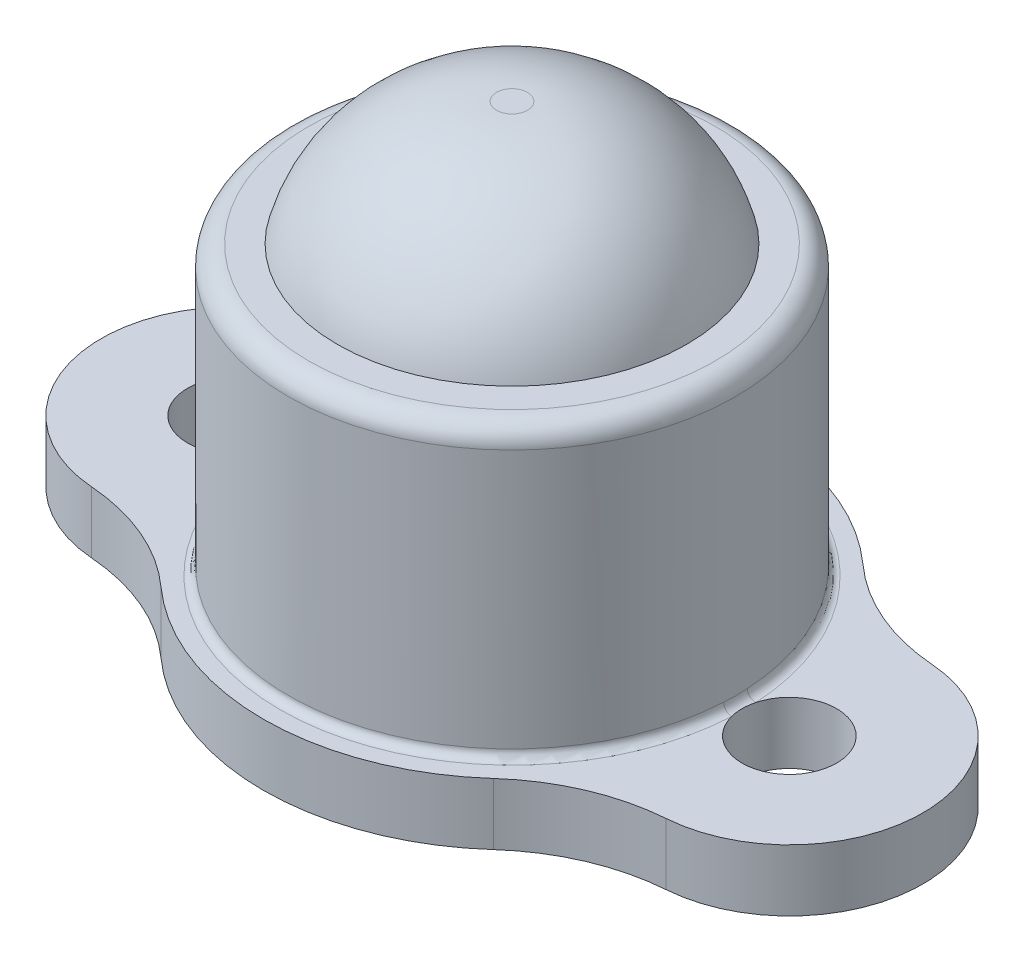
ISO-10303-21;
HEADER;
FILE_DESCRIPTION(('STEP AP214'),'2;1');
FILE_NAME('part.step','',(''),(''),'','','');
FILE_SCHEMA(('AUTOMOTIVE_DESIGN { 1 0 10303 214 1 1 1 1 }'));
ENDSEC;
DATA;
#1=APPLICATION_CONTEXT('core data for automotive mechanical design processes');
#2=APPLICATION_PROTOCOL_DEFINITION('international standard','automotive_design',2000,#1);
#3=PRODUCT_CONTEXT('',#1,'mechanical');
#4=PRODUCT('Part','Part','',(#3));
#5=PRODUCT_RELATED_PRODUCT_CATEGORY('part','',(#4));
#6=PRODUCT_DEFINITION_FORMATION('','',#4);
#7=PRODUCT_DEFINITION_CONTEXT('part definition',#1,'design');
#8=PRODUCT_DEFINITION('design','',#6,#7);
#9=PRODUCT_DEFINITION_SHAPE('','',#8);
#10=(LENGTH_UNIT() NAMED_UNIT(*) SI_UNIT(.MILLI.,.METRE.));
#11=(NAMED_UNIT(*) PLANE_ANGLE_UNIT() SI_UNIT($,.RADIAN.));
#12=(NAMED_UNIT(*) SI_UNIT($,.STERADIAN.) SOLID_ANGLE_UNIT());
#13=UNCERTAINTY_MEASURE_WITH_UNIT(LENGTH_MEASURE(1.E-05),#10,'distance_accuracy_value','');
#14=(GEOMETRIC_REPRESENTATION_CONTEXT(3) GLOBAL_UNCERTAINTY_ASSIGNED_CONTEXT((#13)) GLOBAL_UNIT_ASSIGNED_CONTEXT((#10,
#11,#12)) REPRESENTATION_CONTEXT('',''));
#15=CARTESIAN_POINT('',(0.,0.,0.));
#16=DIRECTION('',(0.,0.,1.));
#17=DIRECTION('',(1.,0.,0.));
#18=AXIS2_PLACEMENT_3D('',#15,#16,#17);
#19=CARTESIAN_POINT('',(0.,8.5,0.));
#20=DIRECTION('',(0.,1.,0.));
#21=DIRECTION('',(0.,0.,1.));
#22=AXIS2_PLACEMENT_3D('',#19,#20,#21);
#23=PLANE('',#22);
#24=CARTESIAN_POINT('',(0.,8.5,0.));
#25=DIRECTION('',(0.,1.,0.));
#26=DIRECTION('',(0.,0.,1.));
#27=AXIS2_PLACEMENT_3D('',#24,#25,#26);
#28=CIRCLE('',#27,4.94689619894046);
#29=CARTESIAN_POINT('',(0.,8.5,4.94689619894046));
#30=VERTEX_POINT('',#29);
#31=EDGE_CURVE('E157',#30,#30,#28,.T.);
#32=ORIENTED_EDGE('',*,*,#31,.T.);
#33=EDGE_LOOP('',(#32));
#34=FACE_BOUND('',#33,.T.);
#35=CARTESIAN_POINT('',(0.,8.5,0.));
#36=DIRECTION('',(0.,1.,0.));
#37=DIRECTION('',(0.,0.,1.));
#38=AXIS2_PLACEMENT_3D('',#35,#36,#37);
#39=CIRCLE('',#38,4.25);
#40=CARTESIAN_POINT('',(0.,8.5,4.25));
#41=VERTEX_POINT('',#40);
#42=EDGE_CURVE('E212',#41,#41,#39,.T.);
#43=ORIENTED_EDGE('',*,*,#42,.F.);
#44=EDGE_LOOP('',(#43));
#45=FACE_BOUND('',#44,.T.);
#46=ADVANCED_FACE('F37',(#34,#45),#23,.T.);
#47=CARTESIAN_POINT('',(0.,1.5,0.));
#48=DIRECTION('',(0.,1.,0.));
#49=DIRECTION('',(0.,0.,1.));
#50=AXIS2_PLACEMENT_3D('',#47,#48,#49);
#51=PLANE('',#50);
#52=CARTESIAN_POINT('',(7.36510311983557,1.5,-8.1959493662931));
#53=DIRECTION('',(0.,1.,0.));
#54=DIRECTION('',(0.,0.,1.));
#55=AXIS2_PLACEMENT_3D('',#52,#53,#54);
#56=CIRCLE('',#55,4.96899859246075);
#57=CARTESIAN_POINT('',(6.99322733688011,1.5,-3.24088575278337));
#58=VERTEX_POINT('',#57);
#59=CARTESIAN_POINT('',(4.04382244911915,1.5,-4.5));
#60=VERTEX_POINT('',#59);
#61=EDGE_CURVE('E140',#58,#60,#56,.F.);
#62=ORIENTED_EDGE('',*,*,#61,.T.);
#63=CARTESIAN_POINT('',(0.,1.5,0.));
#64=DIRECTION('',(0.,1.,0.));
#65=DIRECTION('',(0.,0.,1.));
#66=AXIS2_PLACEMENT_3D('',#63,#64,#65);
#67=CIRCLE('',#66,6.05);
#68=CARTESIAN_POINT('',(-4.04382244911915,1.5,-4.5));
#69=VERTEX_POINT('',#68);
#70=EDGE_CURVE('E128',#60,#69,#67,.T.);
#71=ORIENTED_EDGE('',*,*,#70,.T.);
#72=CARTESIAN_POINT('',(-7.36510311983557,1.5,-8.1959493662931));
#73=DIRECTION('',(0.,1.,0.));
#74=DIRECTION('',(0.,0.,1.));
#75=AXIS2_PLACEMENT_3D('',#72,#73,#74);
#76=CIRCLE('',#75,4.96899859246075);
#77=CARTESIAN_POINT('',(-6.99322733688011,1.5,-3.24088575278337));
#78=VERTEX_POINT('',#77);
#79=EDGE_CURVE('E139',#78,#69,#76,.T.);
#80=ORIENTED_EDGE('',*,*,#79,.F.);
#81=CARTESIAN_POINT('',(-6.75,1.5,0.));
#82=DIRECTION('',(0.,1.,0.));
#83=DIRECTION('',(0.,0.,1.));
#84=AXIS2_PLACEMENT_3D('',#81,#82,#83);
#85=CIRCLE('',#84,3.25);
#86=CARTESIAN_POINT('',(-6.99322733688011,1.5,3.24088575278337));
#87=VERTEX_POINT('',#86);
#88=EDGE_CURVE('E347',#78,#87,#85,.T.);
#89=ORIENTED_EDGE('',*,*,#88,.T.);
#90=CARTESIAN_POINT('',(-7.36510311983557,1.5,8.1959493662931));
#91=DIRECTION('',(0.,1.,0.));
#92=DIRECTION('',(0.,0.,1.));
#93=AXIS2_PLACEMENT_3D('',#90,#91,#92);
#94=CIRCLE('',#93,4.96899859246075);
#95=CARTESIAN_POINT('',(-4.04382244911915,1.5,4.5));
#96=VERTEX_POINT('',#95);
#97=EDGE_CURVE('E366',#87,#96,#94,.F.);
#98=ORIENTED_EDGE('',*,*,#97,.T.);
#99=CARTESIAN_POINT('',(0.,1.5,0.));
#100=DIRECTION('',(0.,1.,0.));
#101=DIRECTION('',(0.,0.,1.));
#102=AXIS2_PLACEMENT_3D('',#99,#100,#101);
#103=CIRCLE('',#102,6.05);
#104=CARTESIAN_POINT('',(4.04382244911915,1.5,4.5));
#105=VERTEX_POINT('',#104);
#106=EDGE_CURVE('E363',#96,#105,#103,.T.);
#107=ORIENTED_EDGE('',*,*,#106,.T.);
#108=CARTESIAN_POINT('',(7.36510311983557,1.5,8.1959493662931));
#109=DIRECTION('',(0.,1.,0.));
#110=DIRECTION('',(0.,0.,1.));
#111=AXIS2_PLACEMENT_3D('',#108,#109,#110);
#112=CIRCLE('',#111,4.96899859246075);
#113=CARTESIAN_POINT('',(6.99322733688011,1.5,3.24088575278337));
#114=VERTEX_POINT('',#113);
#115=EDGE_CURVE('E362',#114,#105,#112,.T.);
#116=ORIENTED_EDGE('',*,*,#115,.F.);
#117=CARTESIAN_POINT('',(6.75,1.5,0.));
#118=DIRECTION('',(0.,1.,0.));
#119=DIRECTION('',(0.,0.,1.));
#120=AXIS2_PLACEMENT_3D('',#117,#118,#119);
#121=CIRCLE('',#120,3.25);
#122=EDGE_CURVE('E147',#58,#114,#121,.F.);
#123=ORIENTED_EDGE('',*,*,#122,.F.);
#124=EDGE_LOOP('',(#62,#71,#80,#89,#98,#107,#116,#123));
#125=FACE_BOUND('',#124,.T.);
#126=CARTESIAN_POINT('',(-6.75,1.5,0.));
#127=DIRECTION('',(0.,1.,0.));
#128=DIRECTION('',(0.,0.,1.));
#129=AXIS2_PLACEMENT_3D('',#126,#127,#128);
#130=CIRCLE('',#129,1.15);
#131=CARTESIAN_POINT('',(-5.63906938382283,1.5,-0.297208960228696));
#132=VERTEX_POINT('',#131);
#133=CARTESIAN_POINT('',(-5.63906938382283,1.5,0.297208960228696));
#134=VERTEX_POINT('',#133);
#135=EDGE_CURVE('E373',#132,#134,#130,.T.);
#136=ORIENTED_EDGE('',*,*,#135,.F.);
#137=CARTESIAN_POINT('',(0.,1.5,0.));
#138=DIRECTION('',(0.,1.,0.));
#139=DIRECTION('',(0.,0.,1.));
#140=AXIS2_PLACEMENT_3D('',#137,#138,#139);
#141=CIRCLE('',#140,5.64689619894046);
#142=CARTESIAN_POINT('',(5.63906938382283,1.5,-0.297208960228695));
#143=VERTEX_POINT('',#142);
#144=EDGE_CURVE('E11',#132,#143,#141,.F.);
#145=ORIENTED_EDGE('',*,*,#144,.T.);
#146=CARTESIAN_POINT('',(6.75,1.5,0.));
#147=DIRECTION('',(0.,1.,0.));
#148=DIRECTION('',(0.,0.,-1.));
#149=AXIS2_PLACEMENT_3D('',#146,#147,#148);
#150=CIRCLE('',#149,1.15);
#151=CARTESIAN_POINT('',(5.63906938382283,1.5,0.297208960228699));
#152=VERTEX_POINT('',#151);
#153=EDGE_CURVE('E56',#152,#143,#150,.T.);
#154=ORIENTED_EDGE('',*,*,#153,.F.);
#155=CARTESIAN_POINT('',(0.,1.5,0.));
#156=DIRECTION('',(0.,1.,0.));
#157=DIRECTION('',(0.,0.,1.));
#158=AXIS2_PLACEMENT_3D('',#155,#156,#157);
#159=CIRCLE('',#158,5.64689619894046);
#160=EDGE_CURVE('E49',#152,#134,#159,.F.);
#161=ORIENTED_EDGE('',*,*,#160,.T.);
#162=EDGE_LOOP('',(#136,#145,#154,#161));
#163=FACE_BOUND('',#162,.T.);
#164=ADVANCED_FACE('F144',(#125,#163),#51,.T.);
#165=CARTESIAN_POINT('',(7.36510311983557,1.5,-8.1959493662931));
#166=DIRECTION('',(0.,-1.,0.));
#167=DIRECTION('',(0.,0.,-1.));
#168=AXIS2_PLACEMENT_3D('',#165,#166,#167);
#169=CYLINDRICAL_SURFACE('',#168,4.96899859246075);
#170=CARTESIAN_POINT('',(7.36510311983557,0.,-8.1959493662931));
#171=DIRECTION('',(0.,1.,0.));
#172=DIRECTION('',(0.,0.,1.));
#173=AXIS2_PLACEMENT_3D('',#170,#171,#172);
#174=CIRCLE('',#173,4.96899859246075);
#175=CARTESIAN_POINT('',(6.99322733688011,0.,-3.24088575278337));
#176=VERTEX_POINT('',#175);
#177=CARTESIAN_POINT('',(4.04382244911915,0.,-4.5));
#178=VERTEX_POINT('',#177);
#179=EDGE_CURVE('E153',#176,#178,#174,.F.);
#180=ORIENTED_EDGE('',*,*,#179,.T.);
#181=DIRECTION('',(0.,-1.,0.));
#182=VECTOR('',#181,1.);
#183=CARTESIAN_POINT('',(4.04382244911915,1.5,-4.5));
#184=LINE('',#183,#182);
#185=EDGE_CURVE('E133',#60,#178,#184,.T.);
#186=ORIENTED_EDGE('',*,*,#185,.F.);
#187=ORIENTED_EDGE('',*,*,#61,.F.);
#188=DIRECTION('',(0.,-1.,0.));
#189=VECTOR('',#188,1.);
#190=CARTESIAN_POINT('',(6.99322733688011,1.5,-3.24088575278337));
#191=LINE('',#190,#189);
#192=EDGE_CURVE('E325',#58,#176,#191,.T.);
#193=ORIENTED_EDGE('',*,*,#192,.T.);
#194=EDGE_LOOP('',(#180,#186,#187,#193));
#195=FACE_BOUND('',#194,.T.);
#196=ADVANCED_FACE('F151',(#195),#169,.F.);
#197=CARTESIAN_POINT('',(0.,1.5,0.));
#198=DIRECTION('',(0.,-1.,0.));
#199=DIRECTION('',(0.,0.,-1.));
#200=AXIS2_PLACEMENT_3D('',#197,#198,#199);
#201=CYLINDRICAL_SURFACE('',#200,6.05);
#202=CARTESIAN_POINT('',(0.,0.,0.));
#203=DIRECTION('',(0.,1.,0.));
#204=DIRECTION('',(0.,0.,1.));
#205=AXIS2_PLACEMENT_3D('',#202,#203,#204);
#206=CIRCLE('',#205,6.05);
#207=CARTESIAN_POINT('',(-4.04382244911915,0.,-4.5));
#208=VERTEX_POINT('',#207);
#209=EDGE_CURVE('E323',#178,#208,#206,.T.);
#210=ORIENTED_EDGE('',*,*,#209,.T.);
#211=DIRECTION('',(0.,-1.,0.));
#212=VECTOR('',#211,1.);
#213=CARTESIAN_POINT('',(-4.04382244911915,1.5,-4.5));
#214=LINE('',#213,#212);
#215=EDGE_CURVE('E135',#69,#208,#214,.T.);
#216=ORIENTED_EDGE('',*,*,#215,.F.);
#217=ORIENTED_EDGE('',*,*,#70,.F.);
#218=ORIENTED_EDGE('',*,*,#185,.T.);
#219=EDGE_LOOP('',(#210,#216,#217,#218));
#220=FACE_BOUND('',#219,.T.);
#221=ADVANCED_FACE('F131',(#220),#201,.T.);
#222=CARTESIAN_POINT('',(-7.36510311983557,1.5,-8.1959493662931));
#223=DIRECTION('',(0.,-1.,0.));
#224=DIRECTION('',(0.,0.,-1.));
#225=AXIS2_PLACEMENT_3D('',#222,#223,#224);
#226=CYLINDRICAL_SURFACE('',#225,4.96899859246075);
#227=CARTESIAN_POINT('',(-7.36510311983557,0.,-8.1959493662931));
#228=DIRECTION('',(0.,1.,0.));
#229=DIRECTION('',(0.,0.,1.));
#230=AXIS2_PLACEMENT_3D('',#227,#228,#229);
#231=CIRCLE('',#230,4.96899859246075);
#232=CARTESIAN_POINT('',(-6.99322733688011,0.,-3.24088575278337));
#233=VERTEX_POINT('',#232);
#234=EDGE_CURVE('E350',#233,#208,#231,.T.);
#235=ORIENTED_EDGE('',*,*,#234,.F.);
#236=DIRECTION('',(0.,-1.,0.));
#237=VECTOR('',#236,1.);
#238=CARTESIAN_POINT('',(-6.99322733688011,1.5,-3.24088575278337));
#239=LINE('',#238,#237);
#240=EDGE_CURVE('E159',#78,#233,#239,.T.);
#241=ORIENTED_EDGE('',*,*,#240,.F.);
#242=ORIENTED_EDGE('',*,*,#79,.T.);
#243=ORIENTED_EDGE('',*,*,#215,.T.);
#244=EDGE_LOOP('',(#235,#241,#242,#243));
#245=FACE_BOUND('',#244,.T.);
#246=ADVANCED_FACE('F278',(#245),#226,.F.);
#247=CARTESIAN_POINT('',(-6.75,1.5,0.));
#248=DIRECTION('',(0.,-1.,0.));
#249=DIRECTION('',(0.,0.,-1.));
#250=AXIS2_PLACEMENT_3D('',#247,#248,#249);
#251=CYLINDRICAL_SURFACE('',#250,3.25);
#252=CARTESIAN_POINT('',(-6.75,0.,0.));
#253=DIRECTION('',(0.,1.,0.));
#254=DIRECTION('',(0.,0.,1.));
#255=AXIS2_PLACEMENT_3D('',#252,#253,#254);
#256=CIRCLE('',#255,3.25);
#257=CARTESIAN_POINT('',(-6.99322733688011,0.,3.24088575278337));
#258=VERTEX_POINT('',#257);
#259=EDGE_CURVE('E346',#233,#258,#256,.T.);
#260=ORIENTED_EDGE('',*,*,#259,.T.);
#261=DIRECTION('',(0.,-1.,0.));
#262=VECTOR('',#261,1.);
#263=CARTESIAN_POINT('',(-6.99322733688011,1.5,3.24088575278337));
#264=LINE('',#263,#262);
#265=EDGE_CURVE('E341',#87,#258,#264,.T.);
#266=ORIENTED_EDGE('',*,*,#265,.F.);
#267=ORIENTED_EDGE('',*,*,#88,.F.);
#268=ORIENTED_EDGE('',*,*,#240,.T.);
#269=EDGE_LOOP('',(#260,#266,#267,#268));
#270=FACE_BOUND('',#269,.T.);
#271=ADVANCED_FACE('F281',(#270),#251,.T.);
#272=CARTESIAN_POINT('',(-7.36510311983557,1.5,8.1959493662931));
#273=DIRECTION('',(0.,-1.,0.));
#274=DIRECTION('',(0.,0.,-1.));
#275=AXIS2_PLACEMENT_3D('',#272,#273,#274);
#276=CYLINDRICAL_SURFACE('',#275,4.96899859246075);
#277=CARTESIAN_POINT('',(-7.36510311983557,0.,8.1959493662931));
#278=DIRECTION('',(0.,1.,0.));
#279=DIRECTION('',(0.,0.,1.));
#280=AXIS2_PLACEMENT_3D('',#277,#278,#279);
#281=CIRCLE('',#280,4.96899859246075);
#282=CARTESIAN_POINT('',(-4.04382244911915,0.,4.5));
#283=VERTEX_POINT('',#282);
#284=EDGE_CURVE('E352',#258,#283,#281,.F.);
#285=ORIENTED_EDGE('',*,*,#284,.T.);
#286=DIRECTION('',(0.,-1.,0.));
#287=VECTOR('',#286,1.);
#288=CARTESIAN_POINT('',(-4.04382244911915,1.5,4.5));
#289=LINE('',#288,#287);
#290=EDGE_CURVE('E338',#96,#283,#289,.T.);
#291=ORIENTED_EDGE('',*,*,#290,.F.);
#292=ORIENTED_EDGE('',*,*,#97,.F.);
#293=ORIENTED_EDGE('',*,*,#265,.T.);
#294=EDGE_LOOP('',(#285,#291,#292,#293));
#295=FACE_BOUND('',#294,.T.);
#296=ADVANCED_FACE('F285',(#295),#276,.F.);
#297=CARTESIAN_POINT('',(0.,1.5,0.));
#298=DIRECTION('',(0.,-1.,0.));
#299=DIRECTION('',(0.,0.,-1.));
#300=AXIS2_PLACEMENT_3D('',#297,#298,#299);
#301=CYLINDRICAL_SURFACE('',#300,6.05);
#302=CARTESIAN_POINT('',(0.,0.,0.));
#303=DIRECTION('',(0.,1.,0.));
#304=DIRECTION('',(0.,0.,1.));
#305=AXIS2_PLACEMENT_3D('',#302,#303,#304);
#306=CIRCLE('',#305,6.05);
#307=CARTESIAN_POINT('',(4.04382244911915,0.,4.5));
#308=VERTEX_POINT('',#307);
#309=EDGE_CURVE('E330',#283,#308,#306,.T.);
#310=ORIENTED_EDGE('',*,*,#309,.T.);
#311=DIRECTION('',(0.,-1.,0.));
#312=VECTOR('',#311,1.);
#313=CARTESIAN_POINT('',(4.04382244911915,1.5,4.5));
#314=LINE('',#313,#312);
#315=EDGE_CURVE('E336',#105,#308,#314,.T.);
#316=ORIENTED_EDGE('',*,*,#315,.F.);
#317=ORIENTED_EDGE('',*,*,#106,.F.);
#318=ORIENTED_EDGE('',*,*,#290,.T.);
#319=EDGE_LOOP('',(#310,#316,#317,#318));
#320=FACE_BOUND('',#319,.T.);
#321=ADVANCED_FACE('F289',(#320),#301,.T.);
#322=CARTESIAN_POINT('',(7.36510311983557,1.5,8.1959493662931));
#323=DIRECTION('',(0.,-1.,0.));
#324=DIRECTION('',(0.,0.,-1.));
#325=AXIS2_PLACEMENT_3D('',#322,#323,#324);
#326=CYLINDRICAL_SURFACE('',#325,4.96899859246075);
#327=CARTESIAN_POINT('',(7.36510311983557,0.,8.1959493662931));
#328=DIRECTION('',(0.,1.,0.));
#329=DIRECTION('',(0.,0.,1.));
#330=AXIS2_PLACEMENT_3D('',#327,#328,#329);
#331=CIRCLE('',#330,4.96899859246075);
#332=CARTESIAN_POINT('',(6.99322733688011,0.,3.24088575278337));
#333=VERTEX_POINT('',#332);
#334=EDGE_CURVE('E328',#333,#308,#331,.T.);
#335=ORIENTED_EDGE('',*,*,#334,.F.);
#336=DIRECTION('',(0.,-1.,0.));
#337=VECTOR('',#336,1.);
#338=CARTESIAN_POINT('',(6.99322733688011,1.5,3.24088575278337));
#339=LINE('',#338,#337);
#340=EDGE_CURVE('E326',#114,#333,#339,.T.);
#341=ORIENTED_EDGE('',*,*,#340,.F.);
#342=ORIENTED_EDGE('',*,*,#115,.T.);
#343=ORIENTED_EDGE('',*,*,#315,.T.);
#344=EDGE_LOOP('',(#335,#341,#342,#343));
#345=FACE_BOUND('',#344,.T.);
#346=ADVANCED_FACE('F272',(#345),#326,.F.);
#347=CARTESIAN_POINT('',(0.,1.5,0.));
#348=DIRECTION('',(0.,-1.,0.));
#349=DIRECTION('',(0.,0.,-1.));
#350=AXIS2_PLACEMENT_3D('',#347,#348,#349);
#351=CYLINDRICAL_SURFACE('',#350,2.94689619894046);
#352=CARTESIAN_POINT('',(0.,0.,0.));
#353=DIRECTION('',(0.,1.,0.));
#354=DIRECTION('',(0.,0.,1.));
#355=AXIS2_PLACEMENT_3D('',#352,#353,#354);
#356=CIRCLE('',#355,2.94689619894046);
#357=CARTESIAN_POINT('',(0.,0.,2.94689619894046));
#358=VERTEX_POINT('',#357);
#359=EDGE_CURVE('E318',#358,#358,#356,.T.);
#360=ORIENTED_EDGE('',*,*,#359,.F.);
#361=EDGE_LOOP('',(#360));
#362=FACE_BOUND('',#361,.T.);
#363=CARTESIAN_POINT('',(0.,8.5,0.));
#364=DIRECTION('',(0.,1.,0.));
#365=DIRECTION('',(0.,0.,1.));
#366=AXIS2_PLACEMENT_3D('',#363,#364,#365);
#367=CIRCLE('',#366,2.94689619894046);
#368=CARTESIAN_POINT('',(0.,8.5,2.94689619894046));
#369=VERTEX_POINT('',#368);
#370=EDGE_CURVE('E382',#369,#369,#367,.F.);
#371=ORIENTED_EDGE('',*,*,#370,.F.);
#372=EDGE_LOOP('',(#371));
#373=FACE_BOUND('',#372,.T.);
#374=ADVANCED_FACE('F268',(#362,#373),#351,.F.);
#375=CARTESIAN_POINT('',(6.75,1.5,0.));
#376=DIRECTION('',(0.,-1.,0.));
#377=DIRECTION('',(0.,0.,-1.));
#378=AXIS2_PLACEMENT_3D('',#375,#376,#377);
#379=CYLINDRICAL_SURFACE('',#378,3.25);
#380=CARTESIAN_POINT('',(6.75,0.,0.));
#381=DIRECTION('',(0.,1.,0.));
#382=DIRECTION('',(0.,0.,1.));
#383=AXIS2_PLACEMENT_3D('',#380,#381,#382);
#384=CIRCLE('',#383,3.25);
#385=EDGE_CURVE('E149',#176,#333,#384,.F.);
#386=ORIENTED_EDGE('',*,*,#385,.F.);
#387=ORIENTED_EDGE('',*,*,#192,.F.);
#388=ORIENTED_EDGE('',*,*,#122,.T.);
#389=ORIENTED_EDGE('',*,*,#340,.T.);
#390=EDGE_LOOP('',(#386,#387,#388,#389));
#391=FACE_BOUND('',#390,.T.);
#392=ADVANCED_FACE('F271',(#391),#379,.T.);
#393=CARTESIAN_POINT('',(0.,0.,0.));
#394=DIRECTION('',(0.,1.,0.));
#395=DIRECTION('',(0.,0.,1.));
#396=AXIS2_PLACEMENT_3D('',#393,#394,#395);
#397=PLANE('',#396);
#398=CARTESIAN_POINT('',(6.75,0.,0.));
#399=DIRECTION('',(0.,1.,0.));
#400=DIRECTION('',(0.,0.,1.));
#401=AXIS2_PLACEMENT_3D('',#398,#399,#400);
#402=CIRCLE('',#401,1.15);
#403=CARTESIAN_POINT('',(6.75,0.,1.15));
#404=VERTEX_POINT('',#403);
#405=EDGE_CURVE('E310',#404,#404,#402,.F.);
#406=ORIENTED_EDGE('',*,*,#405,.F.);
#407=EDGE_LOOP('',(#406));
#408=FACE_BOUND('',#407,.T.);
#409=CARTESIAN_POINT('',(-6.75,0.,0.));
#410=DIRECTION('',(0.,1.,0.));
#411=DIRECTION('',(0.,0.,1.));
#412=AXIS2_PLACEMENT_3D('',#409,#410,#411);
#413=CIRCLE('',#412,1.15);
#414=CARTESIAN_POINT('',(-6.75,0.,1.15));
#415=VERTEX_POINT('',#414);
#416=EDGE_CURVE('E314',#415,#415,#413,.F.);
#417=ORIENTED_EDGE('',*,*,#416,.F.);
#418=EDGE_LOOP('',(#417));
#419=FACE_BOUND('',#418,.T.);
#420=ORIENTED_EDGE('',*,*,#359,.T.);
#421=EDGE_LOOP('',(#420));
#422=FACE_BOUND('',#421,.T.);
#423=ORIENTED_EDGE('',*,*,#179,.F.);
#424=ORIENTED_EDGE('',*,*,#385,.T.);
#425=ORIENTED_EDGE('',*,*,#334,.T.);
#426=ORIENTED_EDGE('',*,*,#309,.F.);
#427=ORIENTED_EDGE('',*,*,#284,.F.);
#428=ORIENTED_EDGE('',*,*,#259,.F.);
#429=ORIENTED_EDGE('',*,*,#234,.T.);
#430=ORIENTED_EDGE('',*,*,#209,.F.);
#431=EDGE_LOOP('',(#423,#424,#425,#426,#427,#428,#429,#430));
#432=FACE_BOUND('',#431,.T.);
#433=ADVANCED_FACE('F298',(#408,#419,#422,#432),#397,.F.);
#434=CARTESIAN_POINT('',(-6.75,-3.25269119345812,0.));
#435=DIRECTION('',(0.,1.,0.));
#436=DIRECTION('',(0.,0.,1.));
#437=AXIS2_PLACEMENT_3D('',#434,#435,#436);
#438=CYLINDRICAL_SURFACE('',#437,1.15);
#439=ORIENTED_EDGE('',*,*,#416,.T.);
#440=EDGE_LOOP('',(#439));
#441=FACE_BOUND('',#440,.T.);
#442=EDGE_CURVE('E370',#134,#132,#130,.T.);
#443=ORIENTED_EDGE('',*,*,#442,.T.);
#444=ORIENTED_EDGE('',*,*,#135,.T.);
#445=EDGE_LOOP('',(#443,#444));
#446=FACE_BOUND('',#445,.T.);
#447=ADVANCED_FACE('F301',(#441,#446),#438,.F.);
#448=CARTESIAN_POINT('',(6.75,-3.25269119345812,0.));
#449=DIRECTION('',(0.,1.,0.));
#450=DIRECTION('',(0.,0.,1.));
#451=AXIS2_PLACEMENT_3D('',#448,#449,#450);
#452=CYLINDRICAL_SURFACE('',#451,1.15);
#453=ORIENTED_EDGE('',*,*,#405,.T.);
#454=EDGE_LOOP('',(#453));
#455=FACE_BOUND('',#454,.T.);
#456=EDGE_CURVE('E380',#143,#152,#150,.T.);
#457=ORIENTED_EDGE('',*,*,#456,.T.);
#458=ORIENTED_EDGE('',*,*,#153,.T.);
#459=EDGE_LOOP('',(#457,#458));
#460=FACE_BOUND('',#459,.T.);
#461=ADVANCED_FACE('F205',(#455,#460),#452,.F.);
#462=CARTESIAN_POINT('',(0.,8.5,0.));
#463=DIRECTION('',(0.,-1.,0.));
#464=DIRECTION('',(0.,0.,-1.));
#465=AXIS2_PLACEMENT_3D('',#462,#463,#464);
#466=CYLINDRICAL_SURFACE('',#465,5.44689619894046);
#467=CARTESIAN_POINT('',(0.,1.7,0.));
#468=DIRECTION('',(0.,1.,0.));
#469=DIRECTION('',(0.,0.,1.));
#470=AXIS2_PLACEMENT_3D('',#467,#468,#469);
#471=CIRCLE('',#470,5.44689619894046);
#472=CARTESIAN_POINT('',(5.43934659150797,1.7,-0.286682506412013));
#473=VERTEX_POINT('',#472);
#474=CARTESIAN_POINT('',(-5.43934659150797,1.7,-0.286682506412014));
#475=VERTEX_POINT('',#474);
#476=EDGE_CURVE('E168',#473,#475,#471,.T.);
#477=ORIENTED_EDGE('',*,*,#476,.T.);
#478=CARTESIAN_POINT('',(-5.4235190524168,1.67727950532013,-0.504102459926552));
#479=CARTESIAN_POINT('',(-5.43070076971012,1.38173068395291,-0.426836063378881));
#480=CARTESIAN_POINT('',(-5.70665870784337,1.5,-0.483672356126479));
#481=CARTESIAN_POINT('',(-5.42565670047543,1.68349660454197,-0.481133907770004));
#482=CARTESIAN_POINT('',(-5.43077758593432,1.40030054344534,-0.422785831983225));
#483=CARTESIAN_POINT('',(-5.69861394321352,1.5,-0.466340194467271));
#484=CARTESIAN_POINT('',(-5.42767190245897,1.68804159533558,-0.457841524957272));
#485=CARTESIAN_POINT('',(-5.4314133194152,1.41739954765745,-0.413082637502617));
#486=CARTESIAN_POINT('',(-5.69062529798567,1.5,-0.447955237972466));
#487=CARTESIAN_POINT('',(-5.43141644634372,1.69466154986054,-0.411015851769007));
#488=CARTESIAN_POINT('',(-5.43321072082022,1.44693869633108,-0.386709889490867));
#489=CARTESIAN_POINT('',(-5.67515611943556,1.5,-0.409430970072772));
#490=CARTESIAN_POINT('',(-5.43314718513049,1.69674891409758,-0.387484380400831));
#491=CARTESIAN_POINT('',(-5.43434641607273,1.45978690391992,-0.370374319266718));
#492=CARTESIAN_POINT('',(-5.6676732163382,1.5,-0.389301021264652));
#493=CARTESIAN_POINT('',(-5.436296465662,1.69936639289213,-0.340463082000713));
#494=CARTESIAN_POINT('',(-5.43667402711847,1.48132474589723,-0.334066370717892));
#495=CARTESIAN_POINT('',(-5.65355701806841,1.5,-0.347558740185773));
#496=CARTESIAN_POINT('',(-5.43771648220679,1.69990401806429,-0.316973607369686));
#497=CARTESIAN_POINT('',(-5.43787219246013,1.49030815119144,-0.314135680125248));
#498=CARTESIAN_POINT('',(-5.64691977474829,1.5,-0.32595407868118));
#499=CARTESIAN_POINT('',(-5.44025380746517,1.70007183865785,-0.269946475588933));
#500=CARTESIAN_POINT('',(-5.44013197073995,1.50520363305062,-0.272158347935737));
#501=CARTESIAN_POINT('',(-5.63470825495002,1.5,-0.281356226855839));
#502=CARTESIAN_POINT('',(-5.44137069480515,1.69970077803812,-0.246408796731536));
#503=CARTESIAN_POINT('',(-5.44120751119222,1.51128205486146,-0.250012717699331));
#504=CARTESIAN_POINT('',(-5.62913546129458,1.5,-0.258361157467956));
#505=CARTESIAN_POINT('',(-5.44438895542486,1.69800246416573,-0.172711044394734));
#506=CARTESIAN_POINT('',(-5.44412624741176,1.52641658596099,-0.179904297475389));
#507=CARTESIAN_POINT('',(-5.61375895444039,1.5,-0.184579689991734));
#508=CARTESIAN_POINT('',(-5.44574922762309,1.69606842507223,-0.122544571571133));
#509=CARTESIAN_POINT('',(-5.44565302713678,1.53222494947881,-0.127718757035615));
#510=CARTESIAN_POINT('',(-5.60629701360133,1.5,-0.131771189064923));
#511=CARTESIAN_POINT('',(-5.4470826655772,1.69419736932644,-0.0221141700457301));
#512=CARTESIAN_POINT('',(-5.44708845993309,1.53772004130409,-0.0237107684340233));
#513=CARTESIAN_POINT('',(-5.59899381467766,1.5,-0.0241448204670984));
#514=CARTESIAN_POINT('',(-5.44705494559254,1.69426162786828,0.0281498004180865));
#515=CARTESIAN_POINT('',(-5.44705187402875,1.53761514605763,0.0300601375778517));
#516=CARTESIAN_POINT('',(-5.59915742279594,1.5,0.0306743079822824));
#517=CARTESIAN_POINT('',(-5.44585282717895,1.69590751173711,0.111699660513613));
#518=CARTESIAN_POINT('',(-5.44577169114925,1.53265830027411,0.116193551686797));
#519=CARTESIAN_POINT('',(-5.60572220288123,1.5,0.120103340723799));
#520=CARTESIAN_POINT('',(-5.44506761030572,1.69697101862934,0.145004489002799));
#521=CARTESIAN_POINT('',(-5.44491600277162,1.52932846321708,0.150561810792077));
#522=CARTESIAN_POINT('',(-5.61000489866518,1.5,0.155303699041868));
#523=CARTESIAN_POINT('',(-5.44288769489912,1.69893698759419,0.211565392156619));
#524=CARTESIAN_POINT('',(-5.44268280077241,1.51909984428065,0.216865509301681));
#525=CARTESIAN_POINT('',(-5.62144768616225,1.5,0.223764409386533));
#526=CARTESIAN_POINT('',(-5.44149356699263,1.69983959933351,0.244821483288501));
#527=CARTESIAN_POINT('',(-5.44127053755381,1.51200627952832,0.249291005262641));
#528=CARTESIAN_POINT('',(-5.62860508341158,1.5,0.257026544776273));
#529=CARTESIAN_POINT('',(-5.43802602422379,1.70012895819966,0.312644013203008));
#530=CARTESIAN_POINT('',(-5.43809297757347,1.4922433284701,0.311217541045197));
#531=CARTESIAN_POINT('',(-5.64551843114877,1.5,0.322175983666487));
#532=CARTESIAN_POINT('',(-5.43592818098061,1.69945505616225,0.347210845199417));
#533=CARTESIAN_POINT('',(-5.43627242919409,1.47890204316493,0.340843188836098));
#534=CARTESIAN_POINT('',(-5.65536504140039,1.5,0.353958682421364));
#535=CARTESIAN_POINT('',(-5.43229337658369,1.69563935087287,0.39895826896801));
#536=CARTESIAN_POINT('',(-5.43382528608136,1.45359612938084,0.377928153949843));
#537=CARTESIAN_POINT('',(-5.67134292976575,1.5,0.399069076214963));
#538=CARTESIAN_POINT('',(-5.43099611414659,1.69389111200626,0.416238486233691));
#539=CARTESIAN_POINT('',(-5.43303065136548,1.44383410349031,0.389396877801614));
#540=CARTESIAN_POINT('',(-5.67688744723624,1.5,0.413715959964618));
#541=CARTESIAN_POINT('',(-5.42824919789447,1.6890873776212,0.45065485982982));
#542=CARTESIAN_POINT('',(-5.43169468429337,1.42216613033548,0.408913191964405));
#543=CARTESIAN_POINT('',(-5.68824545937749,1.5,0.442054160900243));
#544=CARTESIAN_POINT('',(-5.42679918564396,1.68602875325999,0.467790570618371));
#545=CARTESIAN_POINT('',(-5.43116277696528,1.41010003330895,0.416837076051408));
#546=CARTESIAN_POINT('',(-5.69405956793639,1.5,0.455743099178282));
#547=CARTESIAN_POINT('',(-5.42528087508953,1.68213576970775,0.484773790978742));
#548=CARTESIAN_POINT('',(-5.43088708762353,1.39722410217698,0.422032615179994));
#549=CARTESIAN_POINT('',(-5.69993058563361,1.5,0.468886153572735));
#550=(BOUNDED_SURFACE() B_SPLINE_SURFACE(3,2,((#478,#479,#480),(#481,#482,#483),(#484,#485,
#486),(#487,#488,#489),(#490,#491,#492),(#493,#494,#495),(#496,#497,#498),(#499,#500,#501),
(#502,#503,#504),(#505,#506,#507),(#508,#509,#510),(#511,#512,#513),(#514,#515,#516),(#517,#518,
#519),(#520,#521,#522),(#523,#524,#525),(#526,#527,#528),(#529,#530,#531),(#532,#533,#534),
(#535,#536,#537),(#538,#539,#540),(#541,#542,#543),(#544,#545,#546),(#547,#548,#549)),
.UNSPECIFIED.,.F.,.F.,.F.) B_SPLINE_SURFACE_WITH_KNOTS((4,2,2,2,2,2,2,2,2,2,2,4),(3,3),(0.,
0.0739169850604639,0.147459384915979,0.220644766623378,0.293931366730879,0.450091476461137,
0.606351240285779,0.710004724929268,0.813561280827954,0.921166828611147,0.975273297223309,
1.02950968370675),(0.,1.),
.UNSPECIFIED.) GEOMETRIC_REPRESENTATION_ITEM() RATIONAL_B_SPLINE_SURFACE(((1.,0.547645661999465,
1.),(1.,0.56913384705998,1.),(1.,0.589331579400989,1.),(1.,0.626883842775,1.),(1.,
0.644252263450306,1.),(1.,0.67602738129211,1.),(1.,0.690448047087672,1.),(1.,0.716374570277887,
1.),(1.,0.72787636878846,1.),(1.,0.759133473871642,1.),(1.,0.773514150520819,1.),(1.,
0.78760584786103,1.),(1.,0.787307501205851,1.),(1.,0.774611694589233,1.),(1.,0.766321326248267,
1.),(1.,0.74356339039567,1.),(1.,0.729101606573853,1.),(1.,0.693573380360763,1.),(1.,
0.672270808810171,1.),(1.,0.635677192002064,1.),(1.,0.62266304031043,1.),(1.,0.595125650644278,
1.),(1.,0.580598864157281,1.),(1.,0.56536316242677,1.))) REPRESENTATION_ITEM('') SURFACE());
#551=CARTESIAN_POINT('',(-5.4235190524168,1.67727950532013,-0.504102459926552));
#552=CARTESIAN_POINT('',(-5.42565670047543,1.68349660454197,-0.481133907770004));
#553=CARTESIAN_POINT('',(-5.42767190245897,1.68804159533558,-0.457841524957272));
#554=CARTESIAN_POINT('',(-5.43141644634372,1.69466154986054,-0.411015851769007));
#555=CARTESIAN_POINT('',(-5.43314718513049,1.69674891409758,-0.387484380400831));
#556=CARTESIAN_POINT('',(-5.436296465662,1.69936639289213,-0.340463082000713));
#557=CARTESIAN_POINT('',(-5.43771648220679,1.69990401806429,-0.316973607369686));
#558=CARTESIAN_POINT('',(-5.44025380746517,1.70007183865785,-0.269946475588933));
#559=CARTESIAN_POINT('',(-5.44137069480515,1.69970077803812,-0.246408796731536));
#560=CARTESIAN_POINT('',(-5.44438895542486,1.69800246416573,-0.172711044394734));
#561=CARTESIAN_POINT('',(-5.44574922762309,1.69606842507223,-0.122544571571133));
#562=CARTESIAN_POINT('',(-5.4470826655772,1.69419736932644,-0.0221141700457301));
#563=CARTESIAN_POINT('',(-5.44705494559254,1.69426162786828,0.0281498004180865));
#564=CARTESIAN_POINT('',(-5.44585282717895,1.69590751173711,0.111699660513613));
#565=CARTESIAN_POINT('',(-5.44506761030572,1.69697101862934,0.145004489002799));
#566=CARTESIAN_POINT('',(-5.44288769489912,1.69893698759419,0.211565392156619));
#567=CARTESIAN_POINT('',(-5.44149356699263,1.69983959933351,0.244821483288501));
#568=CARTESIAN_POINT('',(-5.43802602422379,1.70012895819966,0.312644013203008));
#569=CARTESIAN_POINT('',(-5.43592818098061,1.69945505616225,0.347210845199417));
#570=CARTESIAN_POINT('',(-5.43229337658369,1.69563935087287,0.39895826896801));
#571=CARTESIAN_POINT('',(-5.43099611414659,1.69389111200626,0.416238486233691));
#572=CARTESIAN_POINT('',(-5.42824919789447,1.6890873776212,0.45065485982982));
#573=CARTESIAN_POINT('',(-5.42679918564396,1.68602875325999,0.467790570618371));
#574=CARTESIAN_POINT('',(-5.42528087508953,1.68213576970775,0.484773790978742));
#575=B_SPLINE_CURVE_WITH_KNOTS('',3,(#551,#552,#553,#554,#555,#556,#557,#558,#559,#560,#561,
#562,#563,#564,#565,#566,#567,#568,#569,#570,#571,#572,#573,#574),.UNSPECIFIED.,.F.,.F.,(4,2,2,
2,2,2,2,2,2,2,2,4),(0.,0.0739169850604639,0.147459384915979,0.220644766623378,0.293931366730879,
0.450091476461137,0.606351240285779,0.710004724929268,0.813561280827954,0.921166828611147,
0.975273297223309,1.02950968370675),.UNSPECIFIED.);
#576=CARTESIAN_POINT('',(-5.43934659150797,1.7,0.286682506412014));
#577=VERTEX_POINT('',#576);
#578=EDGE_CURVE('E398',#475,#577,#575,.T.);
#579=ORIENTED_EDGE('',*,*,#578,.T.);
#580=CARTESIAN_POINT('',(0.,1.7,0.));
#581=DIRECTION('',(0.,1.,0.));
#582=DIRECTION('',(0.,0.,1.));
#583=AXIS2_PLACEMENT_3D('',#580,#581,#582);
#584=CIRCLE('',#583,5.44689619894046);
#585=CARTESIAN_POINT('',(5.43934659150797,1.7,0.286682506412017));
#586=VERTEX_POINT('',#585);
#587=EDGE_CURVE('E177',#577,#586,#584,.T.);
#588=ORIENTED_EDGE('',*,*,#587,.T.);
#589=CARTESIAN_POINT('',(5.4235190524168,1.67727950532013,0.504102459926553));
#590=CARTESIAN_POINT('',(5.43070076970957,1.3817306839464,0.426836063384723));
#591=CARTESIAN_POINT('',(5.70665870784558,1.5,0.483672356131249));
#592=CARTESIAN_POINT('',(5.42565670047613,1.68349660454396,0.481133907762481));
#593=CARTESIAN_POINT('',(5.43077758593414,1.40030054344886,0.422785831984381));
#594=CARTESIAN_POINT('',(5.69861394321183,1.5,0.466340194463714));
#595=CARTESIAN_POINT('',(5.42767190246028,1.68804159533851,0.45784152494207));
#596=CARTESIAN_POINT('',(5.43141331941553,1.41739954766747,0.413082637497457));
#597=CARTESIAN_POINT('',(5.69062529798082,1.5,0.447955237961334));
#598=CARTESIAN_POINT('',(5.43141644634598,1.69466154986391,0.411015851739459));
#599=CARTESIAN_POINT('',(5.43321072082152,1.44693869634843,0.386709889472151));
#600=CARTESIAN_POINT('',(5.67515611942586,1.5,0.409430970047682));
#601=CARTESIAN_POINT('',(5.4331471851331,1.69674891410056,0.387484380364634));
#602=CARTESIAN_POINT('',(5.43434641607447,1.45978690393879,0.3703743192411));
#603=CARTESIAN_POINT('',(5.66767321632676,1.5,0.389301021233262));
#604=CARTESIAN_POINT('',(5.43629646566421,1.69936639289317,0.340463081964952));
#605=CARTESIAN_POINT('',(5.43667402712031,1.48132474591154,0.334066370687755));
#606=CARTESIAN_POINT('',(5.65355701805818,1.5,0.34755874015308));
#607=CARTESIAN_POINT('',(5.43771648220843,1.69990401806467,0.316973607341053));
#608=CARTESIAN_POINT('',(5.43787219246156,1.49030815120152,0.314135680100054));
#609=CARTESIAN_POINT('',(5.64691977474052,1.5,0.3259540786544));
#610=CARTESIAN_POINT('',(5.44025380746585,1.70007183865762,0.269946475574595));
#611=CARTESIAN_POINT('',(5.44013197074062,1.50520363305441,0.272158347921965));
#612=CARTESIAN_POINT('',(5.63470825494661,1.5,0.281356226841756));
#613=CARTESIAN_POINT('',(5.44137069480544,1.69970077803796,0.246408796724366));
#614=CARTESIAN_POINT('',(5.44120751119252,1.51128205486302,0.250012717692108));
#615=CARTESIAN_POINT('',(5.62913546129306,1.5,0.258361157460659));
#616=CARTESIAN_POINT('',(5.44438895542486,1.69800246416573,0.172711044394734));
#617=CARTESIAN_POINT('',(5.44412624741177,1.52641658596102,0.179904297475244));
#618=CARTESIAN_POINT('',(5.61375895444035,1.5,0.184579689991574));
#619=CARTESIAN_POINT('',(5.44574922762309,1.69606842507223,0.122544571571134));
#620=CARTESIAN_POINT('',(5.44565302713678,1.53222494947882,0.127718757035573));
#621=CARTESIAN_POINT('',(5.60629701360132,1.5,0.131771189064875));
#622=CARTESIAN_POINT('',(5.4470826655772,1.69419736932644,0.0221141700457313));
#623=CARTESIAN_POINT('',(5.44708845993309,1.53772004130409,0.0237107684340403));
#624=CARTESIAN_POINT('',(5.59899381467766,1.5,0.0241448204671189));
#625=CARTESIAN_POINT('',(5.44705494559254,1.69426162786828,-0.028149800418086));
#626=CARTESIAN_POINT('',(5.44705187402875,1.53761514605762,-0.0300601375778691));
#627=CARTESIAN_POINT('',(5.59915742279594,1.5,-0.0306743079823047));
#628=CARTESIAN_POINT('',(5.44585282717895,1.69590751173711,-0.111699660513613));
#629=CARTESIAN_POINT('',(5.44577169114925,1.53265830027411,-0.116193551686806));
#630=CARTESIAN_POINT('',(5.60572220288123,1.5,-0.12010334072381));
#631=CARTESIAN_POINT('',(5.44506761030572,1.69697101862934,-0.145004489002799));
#632=CARTESIAN_POINT('',(5.44491600277162,1.52932846321709,-0.150561810792066));
#633=CARTESIAN_POINT('',(5.61000489866518,1.5,-0.155303699041853));
#634=CARTESIAN_POINT('',(5.44288769489912,1.69893698759419,-0.211565392156619));
#635=CARTESIAN_POINT('',(5.44268280077241,1.51909984428066,-0.216865509301665));
#636=CARTESIAN_POINT('',(5.62144768616225,1.5,-0.223764409386516));
#637=CARTESIAN_POINT('',(5.44149356699263,1.69983959933351,-0.244821483288501));
#638=CARTESIAN_POINT('',(5.44127053755381,1.51200627952832,-0.249291005262645));
#639=CARTESIAN_POINT('',(5.62860508341159,1.5,-0.257026544776279));
#640=CARTESIAN_POINT('',(5.43802602422379,1.70012895819966,-0.312644013203008));
#641=CARTESIAN_POINT('',(5.43809297757348,1.49224332847012,-0.311217541045161));
#642=CARTESIAN_POINT('',(5.64551843114876,1.5,-0.32217598366645));
#643=CARTESIAN_POINT('',(5.43592818098061,1.69945505616225,-0.347210845199416));
#644=CARTESIAN_POINT('',(5.4362724291941,1.47890204316498,-0.340843188835987));
#645=CARTESIAN_POINT('',(5.65536504140036,1.5,-0.353958682421259));
#646=CARTESIAN_POINT('',(5.43229337658369,1.69563935087287,-0.39895826896801));
#647=CARTESIAN_POINT('',(5.43382528608137,1.4535961293809,-0.377928153949739));
#648=CARTESIAN_POINT('',(5.67134292976572,1.5,-0.399069076214873));
#649=CARTESIAN_POINT('',(5.43099611414659,1.69389111200626,-0.416238486233691));
#650=CARTESIAN_POINT('',(5.43303065136549,1.44383410349036,-0.389396877801537));
#651=CARTESIAN_POINT('',(5.67688744723621,1.5,-0.413715959964553));
#652=CARTESIAN_POINT('',(5.42824919789447,1.6890873776212,-0.450654859829819));
#653=CARTESIAN_POINT('',(5.43169468429337,1.42216613033553,-0.40891319196435));
#654=CARTESIAN_POINT('',(5.68824545937747,1.5,-0.442054160900195));
#655=CARTESIAN_POINT('',(5.42679918564396,1.68602875325999,-0.46779057061837));
#656=CARTESIAN_POINT('',(5.43116277696528,1.41010003330902,-0.416837076051344));
#657=CARTESIAN_POINT('',(5.69405956793636,1.5,-0.455743099178227));
#658=CARTESIAN_POINT('',(5.42528087508953,1.68213576970775,-0.484773790978741));
#659=CARTESIAN_POINT('',(5.43088708762354,1.39722410217711,-0.422032615179852));
#660=CARTESIAN_POINT('',(5.69993058563356,1.5,-0.46888615357262));
#661=(BOUNDED_SURFACE() B_SPLINE_SURFACE(3,2,((#589,#590,#591),(#592,#593,#594),(#595,#596,
#597),(#598,#599,#600),(#601,#602,#603),(#604,#605,#606),(#607,#608,#609),(#610,#611,#612),
(#613,#614,#615),(#616,#617,#618),(#619,#620,#621),(#622,#623,#624),(#625,#626,#627),(#628,#629,
#630),(#631,#632,#633),(#634,#635,#636),(#637,#638,#639),(#640,#641,#642),(#643,#644,#645),
(#646,#647,#648),(#649,#650,#651),(#652,#653,#654),(#655,#656,#657),(#658,#659,#660)),
.UNSPECIFIED.,.F.,.F.,.F.) B_SPLINE_SURFACE_WITH_KNOTS((4,2,2,2,2,2,2,2,2,2,2,4),(3,3),(0.,
0.0739169850845046,0.147459384960486,0.220644766645665,0.293931366730846,0.450091476461102,
0.606351240285745,0.710004724929234,0.81356128082792,0.921166828611112,0.975273297223275,
1.02950968370672),(0.,1.),
.UNSPECIFIED.) GEOMETRIC_REPRESENTATION_ITEM() RATIONAL_B_SPLINE_SURFACE(((1.,0.547645661993433,
1.),(1.,0.569133847064472,1.),(1.,0.589331579413205,1.),(1.,0.626883842798106,1.),(1.,
0.644252263476721,1.),(1.,0.676027381314488,1.),(1.,0.690448047104371,1.),(1.,0.716374570284944,
1.),(1.,0.727876368791558,1.),(1.,0.759133473871699,1.),(1.,0.773514150520839,1.),(1.,
0.787605847861018,1.),(1.,0.787307501205842,1.),(1.,0.774611694589236,1.),(1.,0.766321326248276,
1.),(1.,0.743563390395671,1.),(1.,0.729101606573842,1.),(1.,0.69357338036079,1.),(1.,
0.672270808810252,1.),(1.,0.635677192002137,1.),(1.,0.622663040310486,1.),(1.,0.595125650644332,
1.),(1.,0.58059886415735,1.),(1.,0.565363162426903,1.))) REPRESENTATION_ITEM('') SURFACE());
#662=CARTESIAN_POINT('',(5.4235190524168,1.67727950532013,0.504102459926553));
#663=CARTESIAN_POINT('',(5.42565670047613,1.68349660454396,0.481133907762481));
#664=CARTESIAN_POINT('',(5.42767190246029,1.68804159533851,0.45784152494207));
#665=CARTESIAN_POINT('',(5.43141644634598,1.69466154986391,0.411015851739459));
#666=CARTESIAN_POINT('',(5.4331471851331,1.69674891410057,0.387484380364634));
#667=CARTESIAN_POINT('',(5.43629646566422,1.69936639289317,0.340463081964952));
#668=CARTESIAN_POINT('',(5.43771648220843,1.69990401806467,0.316973607341053));
#669=CARTESIAN_POINT('',(5.44025380746585,1.70007183865762,0.269946475574595));
#670=CARTESIAN_POINT('',(5.44137069480544,1.69970077803796,0.246408796724366));
#671=CARTESIAN_POINT('',(5.44438895542486,1.69800246416573,0.172711044394734));
#672=CARTESIAN_POINT('',(5.44574922762309,1.69606842507223,0.122544571571134));
#673=CARTESIAN_POINT('',(5.4470826655772,1.69419736932644,0.0221141700457312));
#674=CARTESIAN_POINT('',(5.44705494559254,1.69426162786828,-0.028149800418086));
#675=CARTESIAN_POINT('',(5.44585282717895,1.69590751173711,-0.111699660513613));
#676=CARTESIAN_POINT('',(5.44506761030572,1.69697101862934,-0.1450044890028));
#677=CARTESIAN_POINT('',(5.44288769489912,1.69893698759419,-0.211565392156619));
#678=CARTESIAN_POINT('',(5.44149356699263,1.69983959933351,-0.244821483288501));
#679=CARTESIAN_POINT('',(5.43802602422379,1.70012895819966,-0.312644013203008));
#680=CARTESIAN_POINT('',(5.43592818098061,1.69945505616225,-0.347210845199416));
#681=CARTESIAN_POINT('',(5.43229337658369,1.69563935087287,-0.39895826896801));
#682=CARTESIAN_POINT('',(5.43099611414659,1.69389111200626,-0.416238486233691));
#683=CARTESIAN_POINT('',(5.42824919789447,1.6890873776212,-0.450654859829819));
#684=CARTESIAN_POINT('',(5.42679918564396,1.68602875325999,-0.46779057061837));
#685=CARTESIAN_POINT('',(5.42528087508953,1.68213576970775,-0.484773790978741));
#686=B_SPLINE_CURVE_WITH_KNOTS('',3,(#662,#663,#664,#665,#666,#667,#668,#669,#670,#671,#672,
#673,#674,#675,#676,#677,#678,#679,#680,#681,#682,#683,#684,#685),.UNSPECIFIED.,.F.,.F.,(4,2,2,
2,2,2,2,2,2,2,2,4),(0.,0.0739169850845046,0.147459384960486,0.220644766645665,0.293931366730846,
0.450091476461102,0.606351240285745,0.710004724929234,0.81356128082792,0.921166828611112,
0.975273297223275,1.02950968370672),.UNSPECIFIED.);
#687=EDGE_CURVE('E170',#586,#473,#686,.T.);
#688=ORIENTED_EDGE('',*,*,#687,.T.);
#689=EDGE_LOOP('',(#477,#579,#588,#688));
#690=FACE_BOUND('',#689,.T.);
#691=CARTESIAN_POINT('',(0.,8.,0.));
#692=DIRECTION('',(0.,1.,0.));
#693=DIRECTION('',(0.,0.,1.));
#694=AXIS2_PLACEMENT_3D('',#691,#692,#693);
#695=CIRCLE('',#694,5.44689619894046);
#696=CARTESIAN_POINT('',(0.,8.,5.44689619894046));
#697=VERTEX_POINT('',#696);
#698=EDGE_CURVE('E165',#697,#697,#695,.F.);
#699=ORIENTED_EDGE('',*,*,#698,.T.);
#700=EDGE_LOOP('',(#699));
#701=FACE_BOUND('',#700,.T.);
#702=ADVANCED_FACE('F179',(#690,#701),#466,.T.);
#703=CARTESIAN_POINT('',(0.,11.5,0.));
#704=DIRECTION('',(0.,1.,0.));
#705=DIRECTION('',(0.,0.,1.));
#706=AXIS2_PLACEMENT_3D('',#703,#704,#705);
#707=PLANE('',#706);
#708=CARTESIAN_POINT('',(0.,11.5,0.));
#709=DIRECTION('',(0.,1.,0.));
#710=DIRECTION('',(0.,0.,1.));
#711=AXIS2_PLACEMENT_3D('',#708,#709,#710);
#712=CIRCLE('',#711,0.377016653792584);
#713=CARTESIAN_POINT('',(0.,11.5,0.377016653792584));
#714=VERTEX_POINT('',#713);
#715=EDGE_CURVE('E154',#714,#714,#712,.T.);
#716=ORIENTED_EDGE('',*,*,#715,.T.);
#717=EDGE_LOOP('',(#716));
#718=FACE_BOUND('',#717,.T.);
#719=ADVANCED_FACE('F250',(#718),#707,.T.);
#720=CARTESIAN_POINT('',(0.,8.5,0.));
#721=DIRECTION('',(0.,1.,0.));
#722=DIRECTION('',(0.,0.,1.));
#723=AXIS2_PLACEMENT_3D('',#720,#721,#722);
#724=PLANE('',#723);
#725=ORIENTED_EDGE('',*,*,#370,.T.);
#726=EDGE_LOOP('',(#725));
#727=FACE_BOUND('',#726,.T.);
#728=ADVANCED_FACE('F246',(#727),#724,.F.);
#729=CARTESIAN_POINT('',(0.,7.5,0.));
#730=DIRECTION('',(0.,-1.,0.));
#731=DIRECTION('',(0.,0.,-1.));
#732=AXIS2_PLACEMENT_3D('',#729,#730,#731);
#733=DEGENERATE_TOROIDAL_SURFACE('',#732,0.377016653792584,4.,.T.);
#734=ORIENTED_EDGE('',*,*,#42,.T.);
#735=EDGE_LOOP('',(#734));
#736=FACE_BOUND('',#735,.T.);
#737=ORIENTED_EDGE('',*,*,#715,.F.);
#738=EDGE_LOOP('',(#737));
#739=FACE_BOUND('',#738,.T.);
#740=ADVANCED_FACE('F249',(#736,#739),#733,.T.);
#741=CARTESIAN_POINT('',(0.,8.,0.));
#742=DIRECTION('',(0.,1.,0.));
#743=DIRECTION('',(0.,0.,1.));
#744=AXIS2_PLACEMENT_3D('',#741,#742,#743);
#745=TOROIDAL_SURFACE('',#744,4.94689619894046,0.5);
#746=ORIENTED_EDGE('',*,*,#698,.F.);
#747=EDGE_LOOP('',(#746));
#748=FACE_BOUND('',#747,.T.);
#749=ORIENTED_EDGE('',*,*,#31,.F.);
#750=EDGE_LOOP('',(#749));
#751=FACE_BOUND('',#750,.T.);
#752=ADVANCED_FACE('F187',(#748,#751),#745,.T.);
#753=CARTESIAN_POINT('',(5.63906938382283,1.7,0.297208960228699));
#754=DIRECTION('',(-0.0526322690834063,0.,0.998613961574307));
#755=DIRECTION('',(0.998613961574307,0.,0.0526322690834064));
#756=AXIS2_PLACEMENT_3D('',#753,#754,#755);
#757=CIRCLE('',#756,0.2);
#758=EDGE_CURVE('E213',#152,#586,#757,.F.);
#759=ORIENTED_EDGE('',*,*,#758,.F.);
#760=ORIENTED_EDGE('',*,*,#456,.F.);
#761=CARTESIAN_POINT('',(5.63906938382283,1.7,-0.297208960228695));
#762=DIRECTION('',(0.0526322690834057,0.,0.998613961574307));
#763=DIRECTION('',(0.998613961574307,0.,-0.0526322690834057));
#764=AXIS2_PLACEMENT_3D('',#761,#762,#763);
#765=CIRCLE('',#764,0.2);
#766=EDGE_CURVE('E209',#473,#143,#765,.T.);
#767=ORIENTED_EDGE('',*,*,#766,.F.);
#768=ORIENTED_EDGE('',*,*,#687,.F.);
#769=EDGE_LOOP('',(#759,#760,#767,#768));
#770=FACE_BOUND('',#769,.T.);
#771=ADVANCED_FACE('F191',(#770),#661,.F.);
#772=CARTESIAN_POINT('',(0.,1.7,0.));
#773=DIRECTION('',(0.,1.,0.));
#774=DIRECTION('',(0.,0.,1.));
#775=AXIS2_PLACEMENT_3D('',#772,#773,#774);
#776=TOROIDAL_SURFACE('',#775,5.64689619894046,0.2);
#777=ORIENTED_EDGE('',*,*,#766,.T.);
#778=ORIENTED_EDGE('',*,*,#144,.F.);
#779=CARTESIAN_POINT('',(-5.63906938382283,1.7,-0.297208960228696));
#780=DIRECTION('',(0.0526322690834056,0.,-0.998613961574307));
#781=DIRECTION('',(-0.998613961574307,0.,-0.0526322690834057));
#782=AXIS2_PLACEMENT_3D('',#779,#780,#781);
#783=CIRCLE('',#782,0.2);
#784=EDGE_CURVE('E216',#475,#132,#783,.T.);
#785=ORIENTED_EDGE('',*,*,#784,.F.);
#786=ORIENTED_EDGE('',*,*,#476,.F.);
#787=EDGE_LOOP('',(#777,#778,#785,#786));
#788=FACE_BOUND('',#787,.T.);
#789=ADVANCED_FACE('F196',(#788),#776,.F.);
#790=CARTESIAN_POINT('',(0.,1.7,0.));
#791=DIRECTION('',(0.,1.,0.));
#792=DIRECTION('',(0.,0.,1.));
#793=AXIS2_PLACEMENT_3D('',#790,#791,#792);
#794=TOROIDAL_SURFACE('',#793,5.64689619894046,0.2);
#795=ORIENTED_EDGE('',*,*,#758,.T.);
#796=ORIENTED_EDGE('',*,*,#587,.F.);
#797=CARTESIAN_POINT('',(-5.63906938382283,1.7,0.297208960228696));
#798=DIRECTION('',(0.0526322690834059,0.,0.998613961574307));
#799=DIRECTION('',(0.998613961574307,0.,-0.0526322690834059));
#800=AXIS2_PLACEMENT_3D('',#797,#798,#799);
#801=CIRCLE('',#800,0.2);
#802=EDGE_CURVE('E401',#134,#577,#801,.T.);
#803=ORIENTED_EDGE('',*,*,#802,.F.);
#804=ORIENTED_EDGE('',*,*,#160,.F.);
#805=EDGE_LOOP('',(#795,#796,#803,#804));
#806=FACE_BOUND('',#805,.T.);
#807=ADVANCED_FACE('F229',(#806),#794,.F.);
#808=ORIENTED_EDGE('',*,*,#784,.T.);
#809=ORIENTED_EDGE('',*,*,#442,.F.);
#810=ORIENTED_EDGE('',*,*,#802,.T.);
#811=ORIENTED_EDGE('',*,*,#578,.F.);
#812=EDGE_LOOP('',(#808,#809,#810,#811));
#813=FACE_BOUND('',#812,.T.);
#814=ADVANCED_FACE('F231',(#813),#550,.F.);
#815=CLOSED_SHELL('',(#46,#164,#196,#221,#246,#271,#296,#321,#346,#374,#392,#433,#447,#461,#702,
#719,#728,#740,#752,#771,#789,#807,#814));
#816=MANIFOLD_SOLID_BREP('B2',#815);
#817=ADVANCED_BREP_SHAPE_REPRESENTATION('',(#18,#816),#14);
#818=SHAPE_DEFINITION_REPRESENTATION(#9,#817);
ENDSEC;
END-ISO-10303-21;
